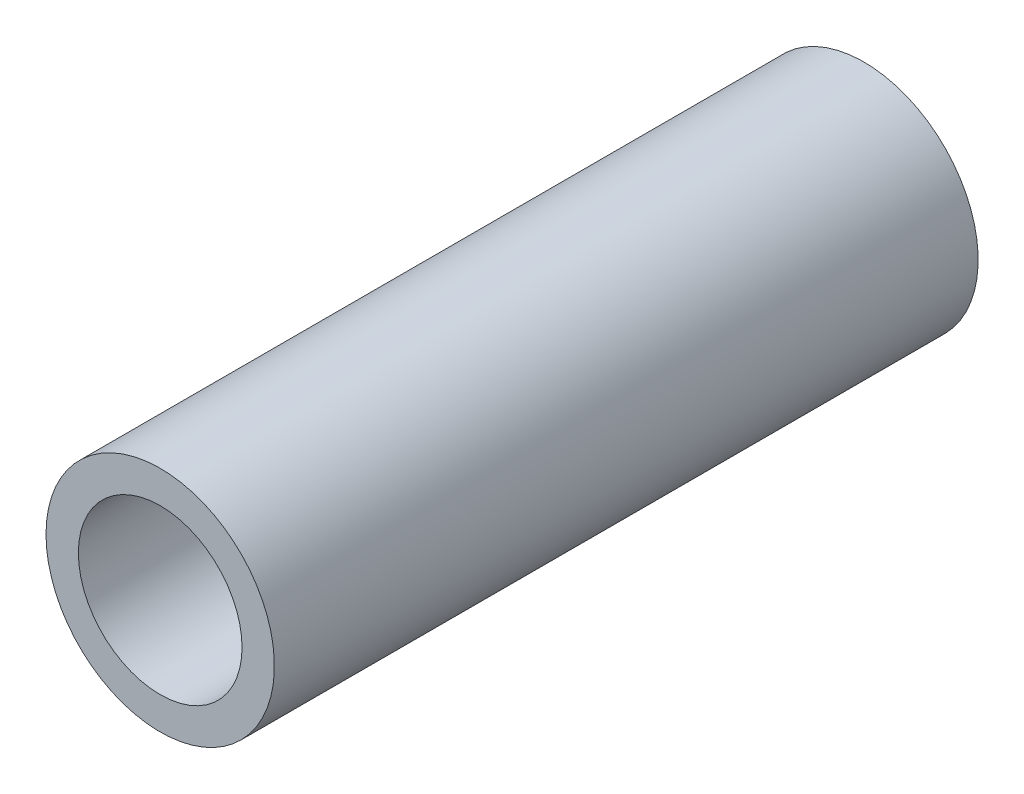
ISO-10303-21;
HEADER;
FILE_DESCRIPTION(('STEP AP214'),'2;1');
FILE_NAME('part.step','',(''),(''),'','','');
FILE_SCHEMA(('AUTOMOTIVE_DESIGN { 1 0 10303 214 1 1 1 1 }'));
ENDSEC;
DATA;
#1=APPLICATION_CONTEXT('core data for automotive mechanical design processes');
#2=APPLICATION_PROTOCOL_DEFINITION('international standard','automotive_design',2000,#1);
#3=PRODUCT_CONTEXT('',#1,'mechanical');
#4=PRODUCT('Part','Part','',(#3));
#5=PRODUCT_RELATED_PRODUCT_CATEGORY('part','',(#4));
#6=PRODUCT_DEFINITION_FORMATION('','',#4);
#7=PRODUCT_DEFINITION_CONTEXT('part definition',#1,'design');
#8=PRODUCT_DEFINITION('design','',#6,#7);
#9=PRODUCT_DEFINITION_SHAPE('','',#8);
#10=(LENGTH_UNIT() NAMED_UNIT(*) SI_UNIT(.MILLI.,.METRE.));
#11=(NAMED_UNIT(*) PLANE_ANGLE_UNIT() SI_UNIT($,.RADIAN.));
#12=(NAMED_UNIT(*) SI_UNIT($,.STERADIAN.) SOLID_ANGLE_UNIT());
#13=UNCERTAINTY_MEASURE_WITH_UNIT(LENGTH_MEASURE(1.E-05),#10,'distance_accuracy_value','');
#14=(GEOMETRIC_REPRESENTATION_CONTEXT(3) GLOBAL_UNCERTAINTY_ASSIGNED_CONTEXT((#13)) GLOBAL_UNIT_ASSIGNED_CONTEXT((#10,
#11,#12)) REPRESENTATION_CONTEXT('',''));
#15=CARTESIAN_POINT('',(0.,0.,0.));
#16=DIRECTION('',(0.,0.,1.));
#17=DIRECTION('',(1.,0.,0.));
#18=AXIS2_PLACEMENT_3D('',#15,#16,#17);
#19=CARTESIAN_POINT('',(0.,0.,18.4875));
#20=DIRECTION('',(0.,0.,-1.));
#21=DIRECTION('',(-1.,0.,0.));
#22=AXIS2_PLACEMENT_3D('',#19,#20,#21);
#23=CYLINDRICAL_SURFACE('',#22,2.15);
#24=CARTESIAN_POINT('',(0.,0.,0.));
#25=DIRECTION('',(0.,0.,-1.));
#26=DIRECTION('',(-1.,0.,0.));
#27=AXIS2_PLACEMENT_3D('',#24,#25,#26);
#28=CIRCLE('',#27,2.15);
#29=CARTESIAN_POINT('',(-2.15,0.,0.));
#30=VERTEX_POINT('',#29);
#31=EDGE_CURVE('E39',#30,#30,#28,.T.);
#32=ORIENTED_EDGE('',*,*,#31,.T.);
#33=EDGE_LOOP('',(#32));
#34=FACE_BOUND('',#33,.T.);
#35=CARTESIAN_POINT('',(0.,0.,18.4875));
#36=DIRECTION('',(0.,0.,-1.));
#37=DIRECTION('',(-1.,0.,0.));
#38=AXIS2_PLACEMENT_3D('',#35,#36,#37);
#39=CIRCLE('',#38,2.15);
#40=CARTESIAN_POINT('',(-2.15,0.,18.4875));
#41=VERTEX_POINT('',#40);
#42=EDGE_CURVE('E26',#41,#41,#39,.T.);
#43=ORIENTED_EDGE('',*,*,#42,.F.);
#44=EDGE_LOOP('',(#43));
#45=FACE_BOUND('',#44,.T.);
#46=ADVANCED_FACE('F23',(#34,#45),#23,.F.);
#47=CARTESIAN_POINT('',(0.,0.,18.4875));
#48=DIRECTION('',(0.,0.,1.));
#49=DIRECTION('',(1.,0.,0.));
#50=AXIS2_PLACEMENT_3D('',#47,#48,#49);
#51=PLANE('',#50);
#52=ORIENTED_EDGE('',*,*,#42,.T.);
#53=EDGE_LOOP('',(#52));
#54=FACE_BOUND('',#53,.T.);
#55=CARTESIAN_POINT('',(0.,0.,18.4875));
#56=DIRECTION('',(0.,0.,-1.));
#57=DIRECTION('',(-1.,0.,0.));
#58=AXIS2_PLACEMENT_3D('',#55,#56,#57);
#59=CIRCLE('',#58,3.);
#60=CARTESIAN_POINT('',(-3.,0.,18.4875));
#61=VERTEX_POINT('',#60);
#62=EDGE_CURVE('E31',#61,#61,#59,.T.);
#63=ORIENTED_EDGE('',*,*,#62,.F.);
#64=EDGE_LOOP('',(#63));
#65=FACE_BOUND('',#64,.T.);
#66=ADVANCED_FACE('F48',(#54,#65),#51,.T.);
#67=CARTESIAN_POINT('',(0.,0.,0.));
#68=DIRECTION('',(0.,0.,1.));
#69=DIRECTION('',(1.,0.,0.));
#70=AXIS2_PLACEMENT_3D('',#67,#68,#69);
#71=PLANE('',#70);
#72=ORIENTED_EDGE('',*,*,#31,.F.);
#73=EDGE_LOOP('',(#72));
#74=FACE_BOUND('',#73,.T.);
#75=CARTESIAN_POINT('',(0.,0.,0.));
#76=DIRECTION('',(0.,0.,-1.));
#77=DIRECTION('',(-1.,0.,0.));
#78=AXIS2_PLACEMENT_3D('',#75,#76,#77);
#79=CIRCLE('',#78,3.);
#80=CARTESIAN_POINT('',(-3.,0.,0.));
#81=VERTEX_POINT('',#80);
#82=EDGE_CURVE('E12',#81,#81,#79,.F.);
#83=ORIENTED_EDGE('',*,*,#82,.F.);
#84=EDGE_LOOP('',(#83));
#85=FACE_BOUND('',#84,.T.);
#86=ADVANCED_FACE('F56',(#74,#85),#71,.F.);
#87=CARTESIAN_POINT('',(0.,0.,18.4875));
#88=DIRECTION('',(0.,0.,-1.));
#89=DIRECTION('',(-1.,0.,0.));
#90=AXIS2_PLACEMENT_3D('',#87,#88,#89);
#91=CYLINDRICAL_SURFACE('',#90,3.);
#92=ORIENTED_EDGE('',*,*,#82,.T.);
#93=EDGE_LOOP('',(#92));
#94=FACE_BOUND('',#93,.T.);
#95=ORIENTED_EDGE('',*,*,#62,.T.);
#96=EDGE_LOOP('',(#95));
#97=FACE_BOUND('',#96,.T.);
#98=ADVANCED_FACE('F57',(#94,#97),#91,.T.);
#99=CLOSED_SHELL('',(#46,#66,#86,#98));
#100=MANIFOLD_SOLID_BREP('B1',#99);
#101=ADVANCED_BREP_SHAPE_REPRESENTATION('',(#18,#100),#14);
#102=SHAPE_DEFINITION_REPRESENTATION(#9,#101);
ENDSEC;
END-ISO-10303-21;
